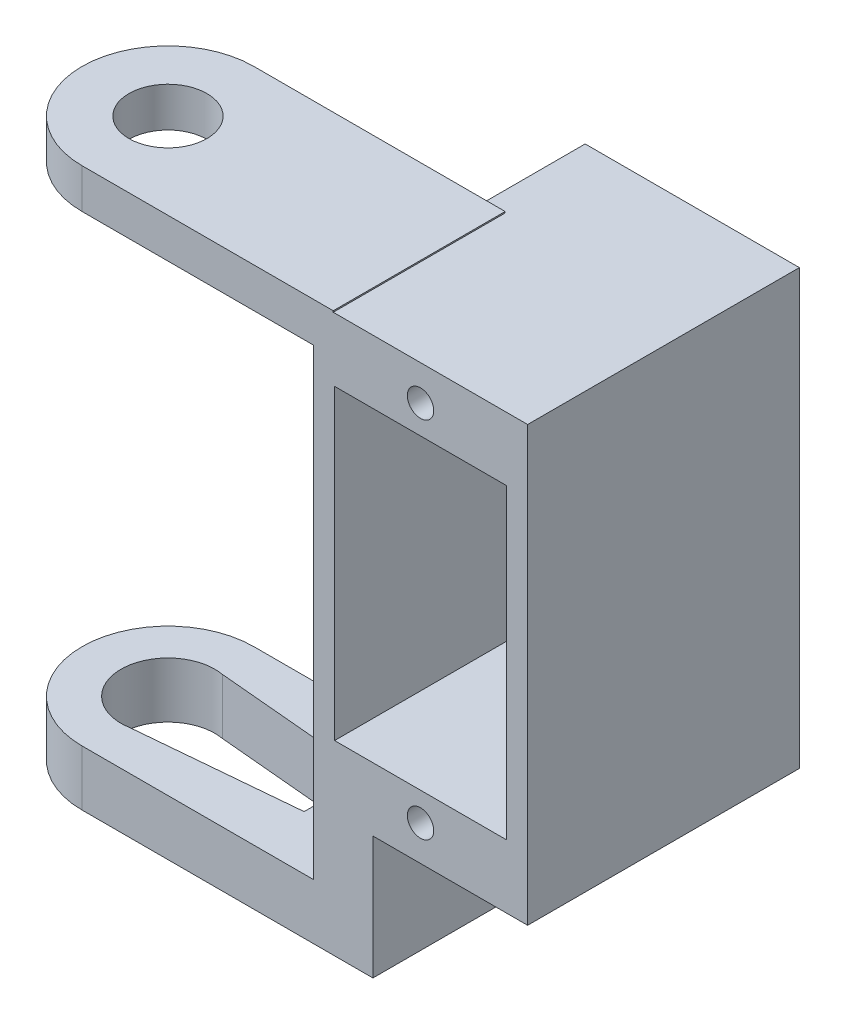
ISO-10303-21;
HEADER;
FILE_DESCRIPTION(('STEP AP214'),'2;1');
FILE_NAME('part.step','',(''),(''),'','','');
FILE_SCHEMA(('AUTOMOTIVE_DESIGN { 1 0 10303 214 1 1 1 1 }'));
ENDSEC;
DATA;
#1=APPLICATION_CONTEXT('core data for automotive mechanical design processes');
#2=APPLICATION_PROTOCOL_DEFINITION('international standard','automotive_design',2000,#1);
#3=PRODUCT_CONTEXT('',#1,'mechanical');
#4=PRODUCT('Part','Part','',(#3));
#5=PRODUCT_RELATED_PRODUCT_CATEGORY('part','',(#4));
#6=PRODUCT_DEFINITION_FORMATION('','',#4);
#7=PRODUCT_DEFINITION_CONTEXT('part definition',#1,'design');
#8=PRODUCT_DEFINITION('design','',#6,#7);
#9=PRODUCT_DEFINITION_SHAPE('','',#8);
#10=(LENGTH_UNIT() NAMED_UNIT(*) SI_UNIT(.MILLI.,.METRE.));
#11=(NAMED_UNIT(*) PLANE_ANGLE_UNIT() SI_UNIT($,.RADIAN.));
#12=(NAMED_UNIT(*) SI_UNIT($,.STERADIAN.) SOLID_ANGLE_UNIT());
#13=UNCERTAINTY_MEASURE_WITH_UNIT(LENGTH_MEASURE(1.E-05),#10,'distance_accuracy_value','');
#14=(GEOMETRIC_REPRESENTATION_CONTEXT(3) GLOBAL_UNCERTAINTY_ASSIGNED_CONTEXT((#13)) GLOBAL_UNIT_ASSIGNED_CONTEXT((#10,
#11,#12)) REPRESENTATION_CONTEXT('',''));
#15=CARTESIAN_POINT('',(0.,0.,0.));
#16=DIRECTION('',(0.,0.,1.));
#17=DIRECTION('',(1.,0.,0.));
#18=AXIS2_PLACEMENT_3D('',#15,#16,#17);
#19=CARTESIAN_POINT('',(-67.5,-75.4,6.5));
#20=DIRECTION('',(1.,0.,0.));
#21=DIRECTION('',(0.,0.,-1.));
#22=AXIS2_PLACEMENT_3D('',#19,#20,#21);
#23=PLANE('',#22);
#24=DIRECTION('',(0.,-1.,0.));
#25=VECTOR('',#24,1.);
#26=CARTESIAN_POINT('',(-67.5,-75.4,-6.50000000000001));
#27=LINE('',#26,#25);
#28=CARTESIAN_POINT('',(-67.5,-42.6,-6.50000000000001));
#29=VERTEX_POINT('',#28);
#30=CARTESIAN_POINT('',(-67.5,-45.5,-6.50000000000001));
#31=VERTEX_POINT('',#30);
#32=EDGE_CURVE('E380',#29,#31,#27,.T.);
#33=ORIENTED_EDGE('',*,*,#32,.F.);
#34=DIRECTION('',(0.,0.,-1.));
#35=VECTOR('',#34,1.);
#36=CARTESIAN_POINT('',(-67.5,-42.6,6.5));
#37=LINE('',#36,#35);
#38=CARTESIAN_POINT('',(-67.5,-42.6,-14.05));
#39=VERTEX_POINT('',#38);
#40=EDGE_CURVE('E486',#29,#39,#37,.T.);
#41=ORIENTED_EDGE('',*,*,#40,.T.);
#42=DIRECTION('',(0.,-1.,0.));
#43=VECTOR('',#42,1.);
#44=CARTESIAN_POINT('',(-67.5,-75.4,-14.05));
#45=LINE('',#44,#43);
#46=CARTESIAN_POINT('',(-67.5,-75.4,-14.05));
#47=VERTEX_POINT('',#46);
#48=EDGE_CURVE('E471',#39,#47,#45,.T.);
#49=ORIENTED_EDGE('',*,*,#48,.T.);
#50=DIRECTION('',(0.,0.,-1.));
#51=VECTOR('',#50,1.);
#52=CARTESIAN_POINT('',(-67.5,-75.4,6.5));
#53=LINE('',#52,#51);
#54=CARTESIAN_POINT('',(-67.5,-75.4,-6.5));
#55=VERTEX_POINT('',#54);
#56=EDGE_CURVE('E509',#55,#47,#53,.T.);
#57=ORIENTED_EDGE('',*,*,#56,.F.);
#58=DIRECTION('',(0.,1.,0.));
#59=VECTOR('',#58,1.);
#60=CARTESIAN_POINT('',(-67.5,-84.7,-6.5));
#61=LINE('',#60,#59);
#62=CARTESIAN_POINT('',(-67.5,-80.5,-6.50000000000001));
#63=VERTEX_POINT('',#62);
#64=EDGE_CURVE('E447',#63,#55,#61,.T.);
#65=ORIENTED_EDGE('',*,*,#64,.F.);
#66=DIRECTION('',(0.,0.,-1.));
#67=VECTOR('',#66,1.);
#68=CARTESIAN_POINT('',(-67.5,-80.5,6.5));
#69=LINE('',#68,#67);
#70=CARTESIAN_POINT('',(-67.5,-80.5,6.50000000000001));
#71=VERTEX_POINT('',#70);
#72=EDGE_CURVE('E444',#71,#63,#69,.T.);
#73=ORIENTED_EDGE('',*,*,#72,.F.);
#74=DIRECTION('',(0.,-1.,0.));
#75=VECTOR('',#74,1.);
#76=CARTESIAN_POINT('',(-67.5,-75.4,6.5));
#77=LINE('',#76,#75);
#78=CARTESIAN_POINT('',(-67.5,-45.5,6.5));
#79=VERTEX_POINT('',#78);
#80=EDGE_CURVE('E472',#79,#71,#77,.T.);
#81=ORIENTED_EDGE('',*,*,#80,.F.);
#82=DIRECTION('',(0.,0.,-1.));
#83=VECTOR('',#82,1.);
#84=CARTESIAN_POINT('',(-67.5,-45.5,6.5));
#85=LINE('',#84,#83);
#86=EDGE_CURVE('E373',#79,#31,#85,.T.);
#87=ORIENTED_EDGE('',*,*,#86,.T.);
#88=EDGE_LOOP('',(#33,#41,#49,#57,#65,#73,#81,#87));
#89=FACE_BOUND('',#88,.T.);
#90=ADVANCED_FACE('F39',(#89),#23,.F.);
#91=CARTESIAN_POINT('',(-67.5,-42.6,6.5));
#92=DIRECTION('',(0.,-1.,0.));
#93=DIRECTION('',(0.,0.,-1.));
#94=AXIS2_PLACEMENT_3D('',#91,#92,#93);
#95=PLANE('',#94);
#96=DIRECTION('',(0.,0.,-1.));
#97=VECTOR('',#96,1.);
#98=CARTESIAN_POINT('',(-66.,-42.6,6.5));
#99=LINE('',#98,#97);
#100=CARTESIAN_POINT('',(-66.,-42.6,6.5));
#101=VERTEX_POINT('',#100);
#102=CARTESIAN_POINT('',(-66.,-42.6,-6.50000000000001));
#103=VERTEX_POINT('',#102);
#104=EDGE_CURVE('E376',#101,#103,#99,.T.);
#105=ORIENTED_EDGE('',*,*,#104,.F.);
#106=DIRECTION('',(-1.,0.,0.));
#107=VECTOR('',#106,1.);
#108=CARTESIAN_POINT('',(-67.5,-42.6,6.5));
#109=LINE('',#108,#107);
#110=CARTESIAN_POINT('',(-51.3,-42.6,6.5));
#111=VERTEX_POINT('',#110);
#112=EDGE_CURVE('E482',#111,#101,#109,.T.);
#113=ORIENTED_EDGE('',*,*,#112,.F.);
#114=DIRECTION('',(0.,0.,-1.));
#115=VECTOR('',#114,1.);
#116=CARTESIAN_POINT('',(-51.3,-42.6,6.5));
#117=LINE('',#116,#115);
#118=CARTESIAN_POINT('',(-51.3,-42.6,-14.05));
#119=VERTEX_POINT('',#118);
#120=EDGE_CURVE('E501',#111,#119,#117,.T.);
#121=ORIENTED_EDGE('',*,*,#120,.T.);
#122=DIRECTION('',(-1.,0.,0.));
#123=VECTOR('',#122,1.);
#124=CARTESIAN_POINT('',(-67.5,-42.6,-14.05));
#125=LINE('',#124,#123);
#126=EDGE_CURVE('E476',#119,#39,#125,.T.);
#127=ORIENTED_EDGE('',*,*,#126,.T.);
#128=ORIENTED_EDGE('',*,*,#40,.F.);
#129=DIRECTION('',(-1.,0.,0.));
#130=VECTOR('',#129,1.);
#131=CARTESIAN_POINT('',(-67.5,-42.6,-6.50000000000001));
#132=LINE('',#131,#130);
#133=EDGE_CURVE('E11',#103,#29,#132,.T.);
#134=ORIENTED_EDGE('',*,*,#133,.F.);
#135=EDGE_LOOP('',(#105,#113,#121,#127,#128,#134));
#136=FACE_BOUND('',#135,.T.);
#137=ADVANCED_FACE('F552',(#136),#95,.F.);
#138=CARTESIAN_POINT('',(-67.5,-75.4,6.5));
#139=DIRECTION('',(0.,1.,0.));
#140=DIRECTION('',(0.,0.,1.));
#141=AXIS2_PLACEMENT_3D('',#138,#139,#140);
#142=PLANE('',#141);
#143=DIRECTION('',(-1.,0.,0.));
#144=VECTOR('',#143,1.);
#145=CARTESIAN_POINT('',(-61.6,-75.4,-10.75));
#146=LINE('',#145,#144);
#147=CARTESIAN_POINT('',(-57.2,-75.4,-10.75));
#148=VERTEX_POINT('',#147);
#149=CARTESIAN_POINT('',(-61.6,-75.4,-10.75));
#150=VERTEX_POINT('',#149);
#151=EDGE_CURVE('E224',#148,#150,#146,.T.);
#152=ORIENTED_EDGE('',*,*,#151,.T.);
#153=DIRECTION('',(0.,0.,1.));
#154=VECTOR('',#153,1.);
#155=CARTESIAN_POINT('',(-61.6,-75.4,-4.75));
#156=LINE('',#155,#154);
#157=CARTESIAN_POINT('',(-61.6,-75.4,-4.75));
#158=VERTEX_POINT('',#157);
#159=EDGE_CURVE('E215',#150,#158,#156,.T.);
#160=ORIENTED_EDGE('',*,*,#159,.T.);
#161=DIRECTION('',(1.,0.,0.));
#162=VECTOR('',#161,1.);
#163=CARTESIAN_POINT('',(-61.6,-75.4,-4.75));
#164=LINE('',#163,#162);
#165=CARTESIAN_POINT('',(-57.2,-75.4,-4.75));
#166=VERTEX_POINT('',#165);
#167=EDGE_CURVE('E227',#158,#166,#164,.T.);
#168=ORIENTED_EDGE('',*,*,#167,.T.);
#169=DIRECTION('',(0.,0.,-1.));
#170=VECTOR('',#169,1.);
#171=CARTESIAN_POINT('',(-57.2,-75.4,-4.75));
#172=LINE('',#171,#170);
#173=EDGE_CURVE('E54',#166,#148,#172,.T.);
#174=ORIENTED_EDGE('',*,*,#173,.T.);
#175=EDGE_LOOP('',(#152,#160,#168,#174));
#176=FACE_BOUND('',#175,.T.);
#177=DIRECTION('',(1.,0.,0.));
#178=VECTOR('',#177,1.);
#179=CARTESIAN_POINT('',(-67.5,-75.4,-6.5));
#180=LINE('',#179,#178);
#181=CARTESIAN_POINT('',(-63.,-75.4,-6.5));
#182=VERTEX_POINT('',#181);
#183=EDGE_CURVE('E512',#55,#182,#180,.T.);
#184=ORIENTED_EDGE('',*,*,#183,.F.);
#185=ORIENTED_EDGE('',*,*,#56,.T.);
#186=DIRECTION('',(1.,0.,0.));
#187=VECTOR('',#186,1.);
#188=CARTESIAN_POINT('',(-67.5,-75.4,-14.05));
#189=LINE('',#188,#187);
#190=CARTESIAN_POINT('',(-51.3,-75.4,-14.05));
#191=VERTEX_POINT('',#190);
#192=EDGE_CURVE('E490',#47,#191,#189,.T.);
#193=ORIENTED_EDGE('',*,*,#192,.T.);
#194=DIRECTION('',(0.,0.,-1.));
#195=VECTOR('',#194,1.);
#196=CARTESIAN_POINT('',(-51.3,-75.4,6.5));
#197=LINE('',#196,#195);
#198=CARTESIAN_POINT('',(-51.3,-75.4,6.5));
#199=VERTEX_POINT('',#198);
#200=EDGE_CURVE('E505',#199,#191,#197,.T.);
#201=ORIENTED_EDGE('',*,*,#200,.F.);
#202=DIRECTION('',(1.,0.,0.));
#203=VECTOR('',#202,1.);
#204=CARTESIAN_POINT('',(-67.5,-75.4,6.5));
#205=LINE('',#204,#203);
#206=CARTESIAN_POINT('',(-63.,-75.4,6.5));
#207=VERTEX_POINT('',#206);
#208=EDGE_CURVE('E475',#207,#199,#205,.T.);
#209=ORIENTED_EDGE('',*,*,#208,.F.);
#210=DIRECTION('',(0.,0.,1.));
#211=VECTOR('',#210,1.);
#212=CARTESIAN_POINT('',(-63.,-75.4,6.5));
#213=LINE('',#212,#211);
#214=EDGE_CURVE('E467',#182,#207,#213,.T.);
#215=ORIENTED_EDGE('',*,*,#214,.F.);
#216=EDGE_LOOP('',(#184,#185,#193,#201,#209,#215));
#217=FACE_BOUND('',#216,.T.);
#218=ADVANCED_FACE('F232',(#176,#217),#142,.F.);
#219=CARTESIAN_POINT('',(-51.3,-75.4,6.5));
#220=DIRECTION('',(-1.,0.,0.));
#221=DIRECTION('',(0.,0.,1.));
#222=AXIS2_PLACEMENT_3D('',#219,#220,#221);
#223=PLANE('',#222);
#224=DIRECTION('',(0.,1.,0.));
#225=VECTOR('',#224,1.);
#226=CARTESIAN_POINT('',(-51.3,-75.4,-14.05));
#227=LINE('',#226,#225);
#228=EDGE_CURVE('E493',#191,#119,#227,.T.);
#229=ORIENTED_EDGE('',*,*,#228,.T.);
#230=ORIENTED_EDGE('',*,*,#120,.F.);
#231=DIRECTION('',(0.,1.,0.));
#232=VECTOR('',#231,1.);
#233=CARTESIAN_POINT('',(-51.3,-75.4,6.5));
#234=LINE('',#233,#232);
#235=EDGE_CURVE('E479',#199,#111,#234,.T.);
#236=ORIENTED_EDGE('',*,*,#235,.F.);
#237=ORIENTED_EDGE('',*,*,#200,.T.);
#238=EDGE_LOOP('',(#229,#230,#236,#237));
#239=FACE_BOUND('',#238,.T.);
#240=ADVANCED_FACE('F722',(#239),#223,.F.);
#241=CARTESIAN_POINT('',(0.,0.,6.5));
#242=DIRECTION('',(0.,0.,-1.));
#243=DIRECTION('',(-1.,0.,0.));
#244=AXIS2_PLACEMENT_3D('',#241,#242,#243);
#245=PLANE('',#244);
#246=CARTESIAN_POINT('',(-59.4,-72.75,6.5));
#247=DIRECTION('',(0.,0.,1.));
#248=DIRECTION('',(1.,0.,0.));
#249=AXIS2_PLACEMENT_3D('',#246,#247,#248);
#250=CIRCLE('',#249,1.);
#251=CARTESIAN_POINT('',(-58.4,-72.75,6.5));
#252=VERTEX_POINT('',#251);
#253=EDGE_CURVE('E262',#252,#252,#250,.T.);
#254=ORIENTED_EDGE('',*,*,#253,.F.);
#255=EDGE_LOOP('',(#254));
#256=FACE_BOUND('',#255,.T.);
#257=CARTESIAN_POINT('',(-59.4,-45.25,6.5));
#258=DIRECTION('',(0.,0.,1.));
#259=DIRECTION('',(1.,0.,0.));
#260=AXIS2_PLACEMENT_3D('',#257,#258,#259);
#261=CIRCLE('',#260,1.);
#262=CARTESIAN_POINT('',(-58.4,-45.25,6.5));
#263=VERTEX_POINT('',#262);
#264=EDGE_CURVE('E270',#263,#263,#261,.T.);
#265=ORIENTED_EDGE('',*,*,#264,.F.);
#266=EDGE_LOOP('',(#265));
#267=FACE_BOUND('',#266,.T.);
#268=DIRECTION('',(1.,0.,0.));
#269=VECTOR('',#268,1.);
#270=CARTESIAN_POINT('',(-65.9,-70.6,6.5));
#271=LINE('',#270,#269);
#272=CARTESIAN_POINT('',(-65.9,-70.6,6.5));
#273=VERTEX_POINT('',#272);
#274=CARTESIAN_POINT('',(-52.9,-70.6,6.5));
#275=VERTEX_POINT('',#274);
#276=EDGE_CURVE('E303',#273,#275,#271,.T.);
#277=ORIENTED_EDGE('',*,*,#276,.F.);
#278=DIRECTION('',(0.,-1.,0.));
#279=VECTOR('',#278,1.);
#280=CARTESIAN_POINT('',(-65.9,-70.6,6.5));
#281=LINE('',#280,#279);
#282=CARTESIAN_POINT('',(-65.9,-47.4,6.5));
#283=VERTEX_POINT('',#282);
#284=EDGE_CURVE('E278',#283,#273,#281,.T.);
#285=ORIENTED_EDGE('',*,*,#284,.F.);
#286=DIRECTION('',(-1.,0.,0.));
#287=VECTOR('',#286,1.);
#288=CARTESIAN_POINT('',(-65.9,-47.4,6.5));
#289=LINE('',#288,#287);
#290=CARTESIAN_POINT('',(-52.9,-47.4,6.5));
#291=VERTEX_POINT('',#290);
#292=EDGE_CURVE('E287',#291,#283,#289,.T.);
#293=ORIENTED_EDGE('',*,*,#292,.F.);
#294=DIRECTION('',(0.,1.,0.));
#295=VECTOR('',#294,1.);
#296=CARTESIAN_POINT('',(-52.9,-70.6,6.5));
#297=LINE('',#296,#295);
#298=EDGE_CURVE('E307',#275,#291,#297,.T.);
#299=ORIENTED_EDGE('',*,*,#298,.F.);
#300=EDGE_LOOP('',(#277,#285,#293,#299));
#301=FACE_BOUND('',#300,.T.);
#302=DIRECTION('',(1.,0.,0.));
#303=VECTOR('',#302,1.);
#304=CARTESIAN_POINT('',(-85.,-45.5,6.50000000000001));
#305=LINE('',#304,#303);
#306=CARTESIAN_POINT('',(-85.,-45.5,6.50000000000001));
#307=VERTEX_POINT('',#306);
#308=EDGE_CURVE('E339',#307,#79,#305,.T.);
#309=ORIENTED_EDGE('',*,*,#308,.T.);
#310=ORIENTED_EDGE('',*,*,#80,.T.);
#311=DIRECTION('',(1.,0.,0.));
#312=VECTOR('',#311,1.);
#313=CARTESIAN_POINT('',(-85.,-80.5,6.50000000000001));
#314=LINE('',#313,#312);
#315=CARTESIAN_POINT('',(-85.,-80.5,6.50000000000001));
#316=VERTEX_POINT('',#315);
#317=EDGE_CURVE('E427',#316,#71,#314,.T.);
#318=ORIENTED_EDGE('',*,*,#317,.F.);
#319=DIRECTION('',(0.,-1.,0.));
#320=VECTOR('',#319,1.);
#321=CARTESIAN_POINT('',(-85.,-80.5,6.50000000000001));
#322=LINE('',#321,#320);
#323=CARTESIAN_POINT('',(-85.,-84.7,6.50000000000001));
#324=VERTEX_POINT('',#323);
#325=EDGE_CURVE('E441',#316,#324,#322,.T.);
#326=ORIENTED_EDGE('',*,*,#325,.T.);
#327=DIRECTION('',(-1.,0.,0.));
#328=VECTOR('',#327,1.);
#329=CARTESIAN_POINT('',(-63.,-84.7,6.5));
#330=LINE('',#329,#328);
#331=CARTESIAN_POINT('',(-63.,-84.7,6.5));
#332=VERTEX_POINT('',#331);
#333=EDGE_CURVE('E463',#332,#324,#330,.T.);
#334=ORIENTED_EDGE('',*,*,#333,.F.);
#335=DIRECTION('',(0.,-1.,0.));
#336=VECTOR('',#335,1.);
#337=CARTESIAN_POINT('',(-63.,-84.7,6.5));
#338=LINE('',#337,#336);
#339=EDGE_CURVE('E448',#207,#332,#338,.T.);
#340=ORIENTED_EDGE('',*,*,#339,.F.);
#341=ORIENTED_EDGE('',*,*,#208,.T.);
#342=ORIENTED_EDGE('',*,*,#235,.T.);
#343=ORIENTED_EDGE('',*,*,#112,.T.);
#344=DIRECTION('',(0.,-1.,0.));
#345=VECTOR('',#344,1.);
#346=CARTESIAN_POINT('',(-66.,-42.5,6.50000000000001));
#347=LINE('',#346,#345);
#348=CARTESIAN_POINT('',(-66.,-42.5,6.50000000000001));
#349=VERTEX_POINT('',#348);
#350=EDGE_CURVE('E366',#349,#101,#347,.T.);
#351=ORIENTED_EDGE('',*,*,#350,.F.);
#352=DIRECTION('',(1.,0.,0.));
#353=VECTOR('',#352,1.);
#354=CARTESIAN_POINT('',(-85.,-42.5,6.50000000000001));
#355=LINE('',#354,#353);
#356=CARTESIAN_POINT('',(-85.,-42.5,6.50000000000001));
#357=VERTEX_POINT('',#356);
#358=EDGE_CURVE('E343',#357,#349,#355,.T.);
#359=ORIENTED_EDGE('',*,*,#358,.F.);
#360=DIRECTION('',(0.,-1.,0.));
#361=VECTOR('',#360,1.);
#362=CARTESIAN_POINT('',(-85.,-42.5,6.50000000000001));
#363=LINE('',#362,#361);
#364=EDGE_CURVE('E370',#357,#307,#363,.T.);
#365=ORIENTED_EDGE('',*,*,#364,.T.);
#366=EDGE_LOOP('',(#309,#310,#318,#326,#334,#340,#341,#342,#343,#351,#359,#365));
#367=FACE_BOUND('',#366,.T.);
#368=ADVANCED_FACE('F571',(#256,#267,#301,#367),#245,.F.);
#369=CARTESIAN_POINT('',(0.,0.,-14.05));
#370=DIRECTION('',(0.,0.,-1.));
#371=DIRECTION('',(-1.,0.,0.));
#372=AXIS2_PLACEMENT_3D('',#369,#370,#371);
#373=PLANE('',#372);
#374=CARTESIAN_POINT('',(-59.4,-64.5,-14.05));
#375=DIRECTION('',(0.,0.,1.));
#376=DIRECTION('',(1.,0.,0.));
#377=AXIS2_PLACEMENT_3D('',#374,#375,#376);
#378=CIRCLE('',#377,3.15);
#379=CARTESIAN_POINT('',(-56.25,-64.5,-14.05));
#380=VERTEX_POINT('',#379);
#381=EDGE_CURVE('E258',#380,#380,#378,.T.);
#382=ORIENTED_EDGE('',*,*,#381,.T.);
#383=EDGE_LOOP('',(#382));
#384=FACE_BOUND('',#383,.T.);
#385=ORIENTED_EDGE('',*,*,#48,.F.);
#386=ORIENTED_EDGE('',*,*,#126,.F.);
#387=ORIENTED_EDGE('',*,*,#228,.F.);
#388=ORIENTED_EDGE('',*,*,#192,.F.);
#389=EDGE_LOOP('',(#385,#386,#387,#388));
#390=FACE_BOUND('',#389,.T.);
#391=ADVANCED_FACE('F580',(#384,#390),#373,.T.);
#392=CARTESIAN_POINT('',(-63.,-84.7,-6.5));
#393=DIRECTION('',(0.,0.,1.));
#394=DIRECTION('',(1.,0.,0.));
#395=AXIS2_PLACEMENT_3D('',#392,#393,#394);
#396=PLANE('',#395);
#397=DIRECTION('',(-1.,0.,0.));
#398=VECTOR('',#397,1.);
#399=CARTESIAN_POINT('',(-63.,-84.7,-6.5));
#400=LINE('',#399,#398);
#401=CARTESIAN_POINT('',(-63.,-84.7,-6.5));
#402=VERTEX_POINT('',#401);
#403=CARTESIAN_POINT('',(-85.,-84.7,-6.50000000000001));
#404=VERTEX_POINT('',#403);
#405=EDGE_CURVE('E458',#402,#404,#400,.T.);
#406=ORIENTED_EDGE('',*,*,#405,.T.);
#407=DIRECTION('',(0.,-1.,0.));
#408=VECTOR('',#407,1.);
#409=CARTESIAN_POINT('',(-85.,-80.5,-6.50000000000001));
#410=LINE('',#409,#408);
#411=CARTESIAN_POINT('',(-85.,-80.5,-6.50000000000001));
#412=VERTEX_POINT('',#411);
#413=EDGE_CURVE('E437',#412,#404,#410,.T.);
#414=ORIENTED_EDGE('',*,*,#413,.F.);
#415=DIRECTION('',(-1.,0.,0.));
#416=VECTOR('',#415,1.);
#417=CARTESIAN_POINT('',(-85.,-80.5,-6.50000000000001));
#418=LINE('',#417,#416);
#419=EDGE_CURVE('E434',#63,#412,#418,.T.);
#420=ORIENTED_EDGE('',*,*,#419,.F.);
#421=ORIENTED_EDGE('',*,*,#64,.T.);
#422=ORIENTED_EDGE('',*,*,#183,.T.);
#423=DIRECTION('',(0.,1.,0.));
#424=VECTOR('',#423,1.);
#425=CARTESIAN_POINT('',(-63.,-84.7,-6.5));
#426=LINE('',#425,#424);
#427=EDGE_CURVE('E454',#402,#182,#426,.T.);
#428=ORIENTED_EDGE('',*,*,#427,.F.);
#429=EDGE_LOOP('',(#406,#414,#420,#421,#422,#428));
#430=FACE_BOUND('',#429,.T.);
#431=ADVANCED_FACE('F588',(#430),#396,.F.);
#432=CARTESIAN_POINT('',(-63.,0.,0.));
#433=DIRECTION('',(-1.,0.,0.));
#434=DIRECTION('',(0.,0.,1.));
#435=AXIS2_PLACEMENT_3D('',#432,#433,#434);
#436=PLANE('',#435);
#437=ORIENTED_EDGE('',*,*,#427,.T.);
#438=ORIENTED_EDGE('',*,*,#214,.T.);
#439=ORIENTED_EDGE('',*,*,#339,.T.);
#440=DIRECTION('',(0.,0.,-1.));
#441=VECTOR('',#440,1.);
#442=CARTESIAN_POINT('',(-63.,-84.7,6.5));
#443=LINE('',#442,#441);
#444=EDGE_CURVE('E451',#332,#402,#443,.T.);
#445=ORIENTED_EDGE('',*,*,#444,.T.);
#446=EDGE_LOOP('',(#437,#438,#439,#445));
#447=FACE_BOUND('',#446,.T.);
#448=ADVANCED_FACE('F591',(#447),#436,.F.);
#449=CARTESIAN_POINT('',(-63.,-84.7,6.5));
#450=DIRECTION('',(0.,1.,0.));
#451=DIRECTION('',(0.,0.,1.));
#452=AXIS2_PLACEMENT_3D('',#449,#450,#451);
#453=PLANE('',#452);
#454=DIRECTION('',(0.,0.,-1.));
#455=VECTOR('',#454,1.);
#456=CARTESIAN_POINT('',(-72.3,-84.7,2.40328140539589));
#457=LINE('',#456,#455);
#458=CARTESIAN_POINT('',(-72.3,-84.7,2.40328140539589));
#459=VERTEX_POINT('',#458);
#460=CARTESIAN_POINT('',(-72.3,-84.7,-2.40328140539589));
#461=VERTEX_POINT('',#460);
#462=EDGE_CURVE('E389',#459,#461,#457,.T.);
#463=ORIENTED_EDGE('',*,*,#462,.T.);
#464=DIRECTION('',(-0.995948362239352,0.,-0.0899269689956983));
#465=VECTOR('',#464,1.);
#466=CARTESIAN_POINT('',(-72.3,-84.7,-2.40328140539589));
#467=LINE('',#466,#465);
#468=CARTESIAN_POINT('',(-84.3641054158039,-84.7,-3.49258329575545));
#469=VERTEX_POINT('',#468);
#470=EDGE_CURVE('E394',#461,#469,#467,.T.);
#471=ORIENTED_EDGE('',*,*,#470,.T.);
#472=CARTESIAN_POINT('',(-85.,-84.7,0.));
#473=DIRECTION('',(0.,1.,0.));
#474=DIRECTION('',(0.,0.,1.));
#475=AXIS2_PLACEMENT_3D('',#472,#473,#474);
#476=CIRCLE('',#475,3.55);
#477=CARTESIAN_POINT('',(-84.3641054158039,-84.7,3.49258329575545));
#478=VERTEX_POINT('',#477);
#479=EDGE_CURVE('E415',#469,#478,#476,.T.);
#480=ORIENTED_EDGE('',*,*,#479,.T.);
#481=DIRECTION('',(0.995948362239352,0.,-0.0899269689956983));
#482=VECTOR('',#481,1.);
#483=CARTESIAN_POINT('',(-85.,-84.7,3.55));
#484=LINE('',#483,#482);
#485=EDGE_CURVE('E385',#478,#459,#484,.T.);
#486=ORIENTED_EDGE('',*,*,#485,.T.);
#487=EDGE_LOOP('',(#463,#471,#480,#486));
#488=FACE_BOUND('',#487,.T.);
#489=ORIENTED_EDGE('',*,*,#333,.T.);
#490=CARTESIAN_POINT('',(-85.,-84.7,0.));
#491=DIRECTION('',(0.,1.,0.));
#492=DIRECTION('',(0.,0.,1.));
#493=AXIS2_PLACEMENT_3D('',#490,#491,#492);
#494=CIRCLE('',#493,6.50000000000001);
#495=EDGE_CURVE('E419',#404,#324,#494,.T.);
#496=ORIENTED_EDGE('',*,*,#495,.F.);
#497=ORIENTED_EDGE('',*,*,#405,.F.);
#498=ORIENTED_EDGE('',*,*,#444,.F.);
#499=EDGE_LOOP('',(#489,#496,#497,#498));
#500=FACE_BOUND('',#499,.T.);
#501=ADVANCED_FACE('F529',(#488,#500),#453,.F.);
#502=CARTESIAN_POINT('',(0.,-80.5,0.));
#503=DIRECTION('',(0.,-1.,0.));
#504=DIRECTION('',(0.,0.,-1.));
#505=AXIS2_PLACEMENT_3D('',#502,#503,#504);
#506=PLANE('',#505);
#507=CARTESIAN_POINT('',(-85.,-80.5,0.));
#508=DIRECTION('',(0.,1.,0.));
#509=DIRECTION('',(0.,0.,1.));
#510=AXIS2_PLACEMENT_3D('',#507,#508,#509);
#511=CIRCLE('',#510,3.55);
#512=CARTESIAN_POINT('',(-84.3641054158039,-80.5,-3.49258329575545));
#513=VERTEX_POINT('',#512);
#514=CARTESIAN_POINT('',(-84.3641054158039,-80.5,3.49258329575545));
#515=VERTEX_POINT('',#514);
#516=EDGE_CURVE('E411',#513,#515,#511,.T.);
#517=ORIENTED_EDGE('',*,*,#516,.F.);
#518=DIRECTION('',(-0.995948362239352,0.,-0.0899269689956983));
#519=VECTOR('',#518,1.);
#520=CARTESIAN_POINT('',(-72.3,-80.5,-2.40328140539589));
#521=LINE('',#520,#519);
#522=CARTESIAN_POINT('',(-72.3,-80.5,-2.40328140539589));
#523=VERTEX_POINT('',#522);
#524=EDGE_CURVE('E390',#523,#513,#521,.T.);
#525=ORIENTED_EDGE('',*,*,#524,.F.);
#526=DIRECTION('',(0.,0.,-1.));
#527=VECTOR('',#526,1.);
#528=CARTESIAN_POINT('',(-72.3,-80.5,2.40328140539589));
#529=LINE('',#528,#527);
#530=CARTESIAN_POINT('',(-72.3,-80.5,2.40328140539589));
#531=VERTEX_POINT('',#530);
#532=EDGE_CURVE('E401',#531,#523,#529,.T.);
#533=ORIENTED_EDGE('',*,*,#532,.F.);
#534=DIRECTION('',(0.995948362239352,0.,-0.0899269689956983));
#535=VECTOR('',#534,1.);
#536=CARTESIAN_POINT('',(-85.,-80.5,3.55));
#537=LINE('',#536,#535);
#538=EDGE_CURVE('E384',#515,#531,#537,.T.);
#539=ORIENTED_EDGE('',*,*,#538,.F.);
#540=EDGE_LOOP('',(#517,#525,#533,#539));
#541=FACE_BOUND('',#540,.T.);
#542=ORIENTED_EDGE('',*,*,#419,.T.);
#543=CARTESIAN_POINT('',(-85.,-80.5,0.));
#544=DIRECTION('',(0.,1.,0.));
#545=DIRECTION('',(0.,0.,1.));
#546=AXIS2_PLACEMENT_3D('',#543,#544,#545);
#547=CIRCLE('',#546,6.50000000000001);
#548=EDGE_CURVE('E423',#412,#316,#547,.T.);
#549=ORIENTED_EDGE('',*,*,#548,.T.);
#550=ORIENTED_EDGE('',*,*,#317,.T.);
#551=ORIENTED_EDGE('',*,*,#72,.T.);
#552=EDGE_LOOP('',(#542,#549,#550,#551));
#553=FACE_BOUND('',#552,.T.);
#554=ADVANCED_FACE('F537',(#541,#553),#506,.F.);
#555=CARTESIAN_POINT('',(-85.,-80.5,0.));
#556=DIRECTION('',(0.,-1.,0.));
#557=DIRECTION('',(0.,0.,-1.));
#558=AXIS2_PLACEMENT_3D('',#555,#556,#557);
#559=CYLINDRICAL_SURFACE('',#558,6.50000000000001);
#560=ORIENTED_EDGE('',*,*,#495,.T.);
#561=ORIENTED_EDGE('',*,*,#325,.F.);
#562=ORIENTED_EDGE('',*,*,#548,.F.);
#563=ORIENTED_EDGE('',*,*,#413,.T.);
#564=EDGE_LOOP('',(#560,#561,#562,#563));
#565=FACE_BOUND('',#564,.T.);
#566=ADVANCED_FACE('F600',(#565),#559,.T.);
#567=CARTESIAN_POINT('',(-85.,-84.7,0.));
#568=DIRECTION('',(0.,1.,0.));
#569=DIRECTION('',(0.,0.,1.));
#570=AXIS2_PLACEMENT_3D('',#567,#568,#569);
#571=CYLINDRICAL_SURFACE('',#570,3.55);
#572=ORIENTED_EDGE('',*,*,#516,.T.);
#573=DIRECTION('',(0.,1.,0.));
#574=VECTOR('',#573,1.);
#575=CARTESIAN_POINT('',(-84.3641054158039,-84.7,3.49258329575545));
#576=LINE('',#575,#574);
#577=EDGE_CURVE('E516',#515,#478,#576,.F.);
#578=ORIENTED_EDGE('',*,*,#577,.T.);
#579=ORIENTED_EDGE('',*,*,#479,.F.);
#580=DIRECTION('',(0.,1.,0.));
#581=VECTOR('',#580,1.);
#582=CARTESIAN_POINT('',(-84.3641054158039,-84.7,-3.49258329575545));
#583=LINE('',#582,#581);
#584=EDGE_CURVE('E47',#469,#513,#583,.T.);
#585=ORIENTED_EDGE('',*,*,#584,.T.);
#586=EDGE_LOOP('',(#572,#578,#579,#585));
#587=FACE_BOUND('',#586,.T.);
#588=ADVANCED_FACE('F523',(#587),#571,.F.);
#589=CARTESIAN_POINT('',(-72.3,-84.7,-2.40328140539589));
#590=DIRECTION('',(0.0899269689956983,0.,-0.995948362239352));
#591=DIRECTION('',(-0.995948362239352,0.,-0.0899269689956983));
#592=AXIS2_PLACEMENT_3D('',#589,#590,#591);
#593=PLANE('',#592);
#594=ORIENTED_EDGE('',*,*,#470,.F.);
#595=DIRECTION('',(0.,1.,0.));
#596=VECTOR('',#595,1.);
#597=CARTESIAN_POINT('',(-72.3,-84.7,-2.40328140539589));
#598=LINE('',#597,#596);
#599=EDGE_CURVE('E408',#461,#523,#598,.T.);
#600=ORIENTED_EDGE('',*,*,#599,.T.);
#601=ORIENTED_EDGE('',*,*,#524,.T.);
#602=ORIENTED_EDGE('',*,*,#584,.F.);
#603=EDGE_LOOP('',(#594,#600,#601,#602));
#604=FACE_BOUND('',#603,.T.);
#605=ADVANCED_FACE('F526',(#604),#593,.F.);
#606=CARTESIAN_POINT('',(-85.,-84.7,3.55));
#607=DIRECTION('',(0.0899269689956983,0.,0.995948362239352));
#608=DIRECTION('',(0.995948362239352,0.,-0.0899269689956983));
#609=AXIS2_PLACEMENT_3D('',#606,#607,#608);
#610=PLANE('',#609);
#611=ORIENTED_EDGE('',*,*,#538,.T.);
#612=DIRECTION('',(0.,1.,0.));
#613=VECTOR('',#612,1.);
#614=CARTESIAN_POINT('',(-72.3,-84.7,2.40328140539589));
#615=LINE('',#614,#613);
#616=EDGE_CURVE('E398',#459,#531,#615,.T.);
#617=ORIENTED_EDGE('',*,*,#616,.F.);
#618=ORIENTED_EDGE('',*,*,#485,.F.);
#619=ORIENTED_EDGE('',*,*,#577,.F.);
#620=EDGE_LOOP('',(#611,#617,#618,#619));
#621=FACE_BOUND('',#620,.T.);
#622=ADVANCED_FACE('F540',(#621),#610,.F.);
#623=CARTESIAN_POINT('',(-72.3,-84.7,2.40328140539589));
#624=DIRECTION('',(1.,0.,0.));
#625=DIRECTION('',(0.,0.,-1.));
#626=AXIS2_PLACEMENT_3D('',#623,#624,#625);
#627=PLANE('',#626);
#628=ORIENTED_EDGE('',*,*,#532,.T.);
#629=ORIENTED_EDGE('',*,*,#599,.F.);
#630=ORIENTED_EDGE('',*,*,#462,.F.);
#631=ORIENTED_EDGE('',*,*,#616,.T.);
#632=EDGE_LOOP('',(#628,#629,#630,#631));
#633=FACE_BOUND('',#632,.T.);
#634=ADVANCED_FACE('F533',(#633),#627,.F.);
#635=CARTESIAN_POINT('',(-85.,-42.5,-6.50000000000001));
#636=DIRECTION('',(0.,0.,1.));
#637=DIRECTION('',(1.,0.,0.));
#638=AXIS2_PLACEMENT_3D('',#635,#636,#637);
#639=PLANE('',#638);
#640=ORIENTED_EDGE('',*,*,#133,.T.);
#641=ORIENTED_EDGE('',*,*,#32,.T.);
#642=DIRECTION('',(-1.,0.,0.));
#643=VECTOR('',#642,1.);
#644=CARTESIAN_POINT('',(-85.,-45.5,-6.50000000000001));
#645=LINE('',#644,#643);
#646=CARTESIAN_POINT('',(-85.,-45.5,-6.50000000000001));
#647=VERTEX_POINT('',#646);
#648=EDGE_CURVE('E347',#31,#647,#645,.T.);
#649=ORIENTED_EDGE('',*,*,#648,.T.);
#650=DIRECTION('',(0.,-1.,0.));
#651=VECTOR('',#650,1.);
#652=CARTESIAN_POINT('',(-85.,-42.5,-6.50000000000001));
#653=LINE('',#652,#651);
#654=CARTESIAN_POINT('',(-85.,-42.5,-6.50000000000001));
#655=VERTEX_POINT('',#654);
#656=EDGE_CURVE('E353',#655,#647,#653,.T.);
#657=ORIENTED_EDGE('',*,*,#656,.F.);
#658=DIRECTION('',(-1.,0.,0.));
#659=VECTOR('',#658,1.);
#660=CARTESIAN_POINT('',(-85.,-42.5,-6.50000000000001));
#661=LINE('',#660,#659);
#662=CARTESIAN_POINT('',(-66.,-42.5,-6.50000000000001));
#663=VERTEX_POINT('',#662);
#664=EDGE_CURVE('E350',#663,#655,#661,.T.);
#665=ORIENTED_EDGE('',*,*,#664,.F.);
#666=DIRECTION('',(0.,-1.,0.));
#667=VECTOR('',#666,1.);
#668=CARTESIAN_POINT('',(-66.,-42.5,-6.50000000000001));
#669=LINE('',#668,#667);
#670=EDGE_CURVE('E362',#663,#103,#669,.T.);
#671=ORIENTED_EDGE('',*,*,#670,.T.);
#672=EDGE_LOOP('',(#640,#641,#649,#657,#665,#671));
#673=FACE_BOUND('',#672,.T.);
#674=ADVANCED_FACE('F547',(#673),#639,.F.);
#675=CARTESIAN_POINT('',(-66.,-42.5,6.50000000000001));
#676=DIRECTION('',(-1.,0.,0.));
#677=DIRECTION('',(0.,0.,1.));
#678=AXIS2_PLACEMENT_3D('',#675,#676,#677);
#679=PLANE('',#678);
#680=ORIENTED_EDGE('',*,*,#350,.T.);
#681=ORIENTED_EDGE('',*,*,#104,.T.);
#682=ORIENTED_EDGE('',*,*,#670,.F.);
#683=DIRECTION('',(0.,0.,-1.));
#684=VECTOR('',#683,1.);
#685=CARTESIAN_POINT('',(-66.,-42.5,6.50000000000001));
#686=LINE('',#685,#684);
#687=EDGE_CURVE('E346',#349,#663,#686,.T.);
#688=ORIENTED_EDGE('',*,*,#687,.F.);
#689=EDGE_LOOP('',(#680,#681,#682,#688));
#690=FACE_BOUND('',#689,.T.);
#691=ADVANCED_FACE('F567',(#690),#679,.F.);
#692=CARTESIAN_POINT('',(0.,-45.5,0.));
#693=DIRECTION('',(0.,-1.,0.));
#694=DIRECTION('',(0.,0.,-1.));
#695=AXIS2_PLACEMENT_3D('',#692,#693,#694);
#696=PLANE('',#695);
#697=CARTESIAN_POINT('',(-85.,-45.5,0.));
#698=DIRECTION('',(0.,1.,0.));
#699=DIRECTION('',(0.,0.,1.));
#700=AXIS2_PLACEMENT_3D('',#697,#698,#699);
#701=CIRCLE('',#700,2.94999999999999);
#702=CARTESIAN_POINT('',(-85.,-45.5,2.94999999999999));
#703=VERTEX_POINT('',#702);
#704=EDGE_CURVE('E327',#703,#703,#701,.T.);
#705=ORIENTED_EDGE('',*,*,#704,.T.);
#706=EDGE_LOOP('',(#705));
#707=FACE_BOUND('',#706,.T.);
#708=ORIENTED_EDGE('',*,*,#308,.F.);
#709=CARTESIAN_POINT('',(-85.,-45.5,0.));
#710=DIRECTION('',(0.,1.,0.));
#711=DIRECTION('',(0.,0.,1.));
#712=AXIS2_PLACEMENT_3D('',#709,#710,#711);
#713=CIRCLE('',#712,6.50000000000001);
#714=EDGE_CURVE('E331',#647,#307,#713,.T.);
#715=ORIENTED_EDGE('',*,*,#714,.F.);
#716=ORIENTED_EDGE('',*,*,#648,.F.);
#717=ORIENTED_EDGE('',*,*,#86,.F.);
#718=EDGE_LOOP('',(#708,#715,#716,#717));
#719=FACE_BOUND('',#718,.T.);
#720=ADVANCED_FACE('F604',(#707,#719),#696,.T.);
#721=CARTESIAN_POINT('',(0.,-42.5,0.));
#722=DIRECTION('',(0.,-1.,0.));
#723=DIRECTION('',(0.,0.,-1.));
#724=AXIS2_PLACEMENT_3D('',#721,#722,#723);
#725=PLANE('',#724);
#726=CARTESIAN_POINT('',(-85.,-42.5,0.));
#727=DIRECTION('',(0.,1.,0.));
#728=DIRECTION('',(0.,0.,1.));
#729=AXIS2_PLACEMENT_3D('',#726,#727,#728);
#730=CIRCLE('',#729,2.94999999999999);
#731=CARTESIAN_POINT('',(-85.,-42.5,2.94999999999999));
#732=VERTEX_POINT('',#731);
#733=EDGE_CURVE('E317',#732,#732,#730,.T.);
#734=ORIENTED_EDGE('',*,*,#733,.F.);
#735=EDGE_LOOP('',(#734));
#736=FACE_BOUND('',#735,.T.);
#737=ORIENTED_EDGE('',*,*,#664,.T.);
#738=CARTESIAN_POINT('',(-85.,-42.5,0.));
#739=DIRECTION('',(0.,1.,0.));
#740=DIRECTION('',(0.,0.,1.));
#741=AXIS2_PLACEMENT_3D('',#738,#739,#740);
#742=CIRCLE('',#741,6.50000000000001);
#743=EDGE_CURVE('E335',#655,#357,#742,.T.);
#744=ORIENTED_EDGE('',*,*,#743,.T.);
#745=ORIENTED_EDGE('',*,*,#358,.T.);
#746=ORIENTED_EDGE('',*,*,#687,.T.);
#747=EDGE_LOOP('',(#737,#744,#745,#746));
#748=FACE_BOUND('',#747,.T.);
#749=ADVANCED_FACE('F610',(#736,#748),#725,.F.);
#750=CARTESIAN_POINT('',(-85.,-42.5,0.));
#751=DIRECTION('',(0.,-1.,0.));
#752=DIRECTION('',(0.,0.,-1.));
#753=AXIS2_PLACEMENT_3D('',#750,#751,#752);
#754=CYLINDRICAL_SURFACE('',#753,6.50000000000001);
#755=ORIENTED_EDGE('',*,*,#714,.T.);
#756=ORIENTED_EDGE('',*,*,#364,.F.);
#757=ORIENTED_EDGE('',*,*,#743,.F.);
#758=ORIENTED_EDGE('',*,*,#656,.T.);
#759=EDGE_LOOP('',(#755,#756,#757,#758));
#760=FACE_BOUND('',#759,.T.);
#761=ADVANCED_FACE('F608',(#760),#754,.T.);
#762=CARTESIAN_POINT('',(-85.,-45.5,0.));
#763=DIRECTION('',(0.,1.,0.));
#764=DIRECTION('',(0.,0.,1.));
#765=AXIS2_PLACEMENT_3D('',#762,#763,#764);
#766=CYLINDRICAL_SURFACE('',#765,2.94999999999999);
#767=ORIENTED_EDGE('',*,*,#704,.F.);
#768=EDGE_LOOP('',(#767));
#769=FACE_BOUND('',#768,.T.);
#770=ORIENTED_EDGE('',*,*,#733,.T.);
#771=EDGE_LOOP('',(#770));
#772=FACE_BOUND('',#771,.T.);
#773=ADVANCED_FACE('F619',(#769,#772),#766,.F.);
#774=CARTESIAN_POINT('',(-65.9,-70.6,-10.75));
#775=DIRECTION('',(-1.,0.,0.));
#776=DIRECTION('',(0.,0.,1.));
#777=AXIS2_PLACEMENT_3D('',#774,#775,#776);
#778=PLANE('',#777);
#779=ORIENTED_EDGE('',*,*,#284,.T.);
#780=DIRECTION('',(0.,0.,1.));
#781=VECTOR('',#780,1.);
#782=CARTESIAN_POINT('',(-65.9,-70.6,-10.75));
#783=LINE('',#782,#781);
#784=CARTESIAN_POINT('',(-65.9,-70.6,-10.75));
#785=VERTEX_POINT('',#784);
#786=EDGE_CURVE('E300',#785,#273,#783,.T.);
#787=ORIENTED_EDGE('',*,*,#786,.F.);
#788=DIRECTION('',(0.,-1.,0.));
#789=VECTOR('',#788,1.);
#790=CARTESIAN_POINT('',(-65.9,-70.6,-10.75));
#791=LINE('',#790,#789);
#792=CARTESIAN_POINT('',(-65.9,-47.4,-10.75));
#793=VERTEX_POINT('',#792);
#794=EDGE_CURVE('E282',#793,#785,#791,.T.);
#795=ORIENTED_EDGE('',*,*,#794,.F.);
#796=DIRECTION('',(0.,0.,1.));
#797=VECTOR('',#796,1.);
#798=CARTESIAN_POINT('',(-65.9,-47.4,-10.75));
#799=LINE('',#798,#797);
#800=EDGE_CURVE('E314',#793,#283,#799,.T.);
#801=ORIENTED_EDGE('',*,*,#800,.T.);
#802=EDGE_LOOP('',(#779,#787,#795,#801));
#803=FACE_BOUND('',#802,.T.);
#804=ADVANCED_FACE('F655',(#803),#778,.F.);
#805=CARTESIAN_POINT('',(-65.9,-47.4,-10.75));
#806=DIRECTION('',(0.,1.,0.));
#807=DIRECTION('',(0.,0.,1.));
#808=AXIS2_PLACEMENT_3D('',#805,#806,#807);
#809=PLANE('',#808);
#810=ORIENTED_EDGE('',*,*,#292,.T.);
#811=ORIENTED_EDGE('',*,*,#800,.F.);
#812=DIRECTION('',(-1.,0.,0.));
#813=VECTOR('',#812,1.);
#814=CARTESIAN_POINT('',(-65.9,-47.4,-10.75));
#815=LINE('',#814,#813);
#816=CARTESIAN_POINT('',(-52.9,-47.4,-10.75));
#817=VERTEX_POINT('',#816);
#818=EDGE_CURVE('E296',#817,#793,#815,.T.);
#819=ORIENTED_EDGE('',*,*,#818,.F.);
#820=DIRECTION('',(0.,0.,1.));
#821=VECTOR('',#820,1.);
#822=CARTESIAN_POINT('',(-52.9,-47.4,-10.75));
#823=LINE('',#822,#821);
#824=EDGE_CURVE('E318',#817,#291,#823,.T.);
#825=ORIENTED_EDGE('',*,*,#824,.T.);
#826=EDGE_LOOP('',(#810,#811,#819,#825));
#827=FACE_BOUND('',#826,.T.);
#828=ADVANCED_FACE('F664',(#827),#809,.F.);
#829=CARTESIAN_POINT('',(-52.9,-70.6,-10.75));
#830=DIRECTION('',(1.,0.,0.));
#831=DIRECTION('',(0.,0.,-1.));
#832=AXIS2_PLACEMENT_3D('',#829,#830,#831);
#833=PLANE('',#832);
#834=ORIENTED_EDGE('',*,*,#298,.T.);
#835=ORIENTED_EDGE('',*,*,#824,.F.);
#836=DIRECTION('',(0.,1.,0.));
#837=VECTOR('',#836,1.);
#838=CARTESIAN_POINT('',(-52.9,-70.6,-10.75));
#839=LINE('',#838,#837);
#840=CARTESIAN_POINT('',(-52.9,-70.6,-10.75));
#841=VERTEX_POINT('',#840);
#842=EDGE_CURVE('E292',#841,#817,#839,.T.);
#843=ORIENTED_EDGE('',*,*,#842,.F.);
#844=DIRECTION('',(0.,0.,1.));
#845=VECTOR('',#844,1.);
#846=CARTESIAN_POINT('',(-52.9,-70.6,-10.75));
#847=LINE('',#846,#845);
#848=EDGE_CURVE('E321',#841,#275,#847,.T.);
#849=ORIENTED_EDGE('',*,*,#848,.T.);
#850=EDGE_LOOP('',(#834,#835,#843,#849));
#851=FACE_BOUND('',#850,.T.);
#852=ADVANCED_FACE('F674',(#851),#833,.F.);
#853=CARTESIAN_POINT('',(-65.9,-70.6,-10.75));
#854=DIRECTION('',(0.,-1.,0.));
#855=DIRECTION('',(0.,0.,-1.));
#856=AXIS2_PLACEMENT_3D('',#853,#854,#855);
#857=PLANE('',#856);
#858=DIRECTION('',(1.,0.,0.));
#859=VECTOR('',#858,1.);
#860=CARTESIAN_POINT('',(-61.6,-70.6,-4.75));
#861=LINE('',#860,#859);
#862=CARTESIAN_POINT('',(-61.6,-70.6,-4.75));
#863=VERTEX_POINT('',#862);
#864=CARTESIAN_POINT('',(-57.2,-70.6,-4.75));
#865=VERTEX_POINT('',#864);
#866=EDGE_CURVE('E238',#863,#865,#861,.T.);
#867=ORIENTED_EDGE('',*,*,#866,.F.);
#868=DIRECTION('',(0.,0.,1.));
#869=VECTOR('',#868,1.);
#870=CARTESIAN_POINT('',(-61.6,-70.6,-4.75));
#871=LINE('',#870,#869);
#872=CARTESIAN_POINT('',(-61.6,-70.6,-10.75));
#873=VERTEX_POINT('',#872);
#874=EDGE_CURVE('E218',#873,#863,#871,.T.);
#875=ORIENTED_EDGE('',*,*,#874,.F.);
#876=DIRECTION('',(1.,0.,0.));
#877=VECTOR('',#876,1.);
#878=CARTESIAN_POINT('',(-65.9,-70.6,-10.75));
#879=LINE('',#878,#877);
#880=EDGE_CURVE('E288',#785,#873,#879,.T.);
#881=ORIENTED_EDGE('',*,*,#880,.F.);
#882=ORIENTED_EDGE('',*,*,#786,.T.);
#883=ORIENTED_EDGE('',*,*,#276,.T.);
#884=ORIENTED_EDGE('',*,*,#848,.F.);
#885=CARTESIAN_POINT('',(-57.2,-70.6,-10.75));
#886=VERTEX_POINT('',#885);
#887=EDGE_CURVE('E286',#886,#841,#879,.T.);
#888=ORIENTED_EDGE('',*,*,#887,.F.);
#889=DIRECTION('',(0.,0.,-1.));
#890=VECTOR('',#889,1.);
#891=CARTESIAN_POINT('',(-57.2,-70.6,-4.75));
#892=LINE('',#891,#890);
#893=EDGE_CURVE('E59',#865,#886,#892,.T.);
#894=ORIENTED_EDGE('',*,*,#893,.F.);
#895=EDGE_LOOP('',(#867,#875,#881,#882,#883,#884,#888,#894));
#896=FACE_BOUND('',#895,.T.);
#897=ADVANCED_FACE('F684',(#896),#857,.F.);
#898=CARTESIAN_POINT('',(0.,0.,-10.75));
#899=DIRECTION('',(0.,0.,-1.));
#900=DIRECTION('',(-1.,0.,0.));
#901=AXIS2_PLACEMENT_3D('',#898,#899,#900);
#902=PLANE('',#901);
#903=ORIENTED_EDGE('',*,*,#794,.T.);
#904=ORIENTED_EDGE('',*,*,#880,.T.);
#905=DIRECTION('',(0.,1.,0.));
#906=VECTOR('',#905,1.);
#907=CARTESIAN_POINT('',(-61.6,-75.4,-10.75));
#908=LINE('',#907,#906);
#909=EDGE_CURVE('E249',#150,#873,#908,.T.);
#910=ORIENTED_EDGE('',*,*,#909,.F.);
#911=ORIENTED_EDGE('',*,*,#151,.F.);
#912=DIRECTION('',(0.,1.,0.));
#913=VECTOR('',#912,1.);
#914=CARTESIAN_POINT('',(-57.2,-75.4,-10.75));
#915=LINE('',#914,#913);
#916=EDGE_CURVE('E253',#148,#886,#915,.T.);
#917=ORIENTED_EDGE('',*,*,#916,.T.);
#918=ORIENTED_EDGE('',*,*,#887,.T.);
#919=ORIENTED_EDGE('',*,*,#842,.T.);
#920=ORIENTED_EDGE('',*,*,#818,.T.);
#921=EDGE_LOOP('',(#903,#904,#910,#911,#917,#918,#919,#920));
#922=FACE_BOUND('',#921,.T.);
#923=ADVANCED_FACE('F698',(#922),#902,.F.);
#924=CARTESIAN_POINT('',(-59.4,-45.25,0.5));
#925=DIRECTION('',(0.,0.,1.));
#926=DIRECTION('',(1.,0.,0.));
#927=AXIS2_PLACEMENT_3D('',#924,#925,#926);
#928=CYLINDRICAL_SURFACE('',#927,1.);
#929=CARTESIAN_POINT('',(-59.4,-45.25,0.5));
#930=DIRECTION('',(0.,0.,1.));
#931=DIRECTION('',(1.,0.,0.));
#932=AXIS2_PLACEMENT_3D('',#929,#930,#931);
#933=CIRCLE('',#932,1.);
#934=CARTESIAN_POINT('',(-58.4,-45.25,0.5));
#935=VERTEX_POINT('',#934);
#936=EDGE_CURVE('E274',#935,#935,#933,.T.);
#937=ORIENTED_EDGE('',*,*,#936,.F.);
#938=EDGE_LOOP('',(#937));
#939=FACE_BOUND('',#938,.T.);
#940=ORIENTED_EDGE('',*,*,#264,.T.);
#941=EDGE_LOOP('',(#940));
#942=FACE_BOUND('',#941,.T.);
#943=ADVANCED_FACE('F692',(#939,#942),#928,.F.);
#944=CARTESIAN_POINT('',(-59.4,-45.25,0.5));
#945=DIRECTION('',(0.,0.,1.));
#946=DIRECTION('',(1.,0.,0.));
#947=AXIS2_PLACEMENT_3D('',#944,#945,#946);
#948=PLANE('',#947);
#949=ORIENTED_EDGE('',*,*,#936,.T.);
#950=EDGE_LOOP('',(#949));
#951=FACE_BOUND('',#950,.T.);
#952=ADVANCED_FACE('F697',(#951),#948,.T.);
#953=CARTESIAN_POINT('',(-59.4,-72.75,0.5));
#954=DIRECTION('',(0.,0.,1.));
#955=DIRECTION('',(1.,0.,0.));
#956=AXIS2_PLACEMENT_3D('',#953,#954,#955);
#957=CYLINDRICAL_SURFACE('',#956,1.);
#958=CARTESIAN_POINT('',(-59.4,-72.75,0.5));
#959=DIRECTION('',(0.,0.,1.));
#960=DIRECTION('',(1.,0.,0.));
#961=AXIS2_PLACEMENT_3D('',#958,#959,#960);
#962=CIRCLE('',#961,1.);
#963=CARTESIAN_POINT('',(-58.4,-72.75,0.5));
#964=VERTEX_POINT('',#963);
#965=EDGE_CURVE('E266',#964,#964,#962,.T.);
#966=ORIENTED_EDGE('',*,*,#965,.F.);
#967=EDGE_LOOP('',(#966));
#968=FACE_BOUND('',#967,.T.);
#969=ORIENTED_EDGE('',*,*,#253,.T.);
#970=EDGE_LOOP('',(#969));
#971=FACE_BOUND('',#970,.T.);
#972=ADVANCED_FACE('F710',(#968,#971),#957,.F.);
#973=CARTESIAN_POINT('',(-59.4,-72.75,0.5));
#974=DIRECTION('',(0.,0.,1.));
#975=DIRECTION('',(1.,0.,0.));
#976=AXIS2_PLACEMENT_3D('',#973,#974,#975);
#977=PLANE('',#976);
#978=ORIENTED_EDGE('',*,*,#965,.T.);
#979=EDGE_LOOP('',(#978));
#980=FACE_BOUND('',#979,.T.);
#981=ADVANCED_FACE('F734',(#980),#977,.T.);
#982=CARTESIAN_POINT('',(-59.4,-64.5,-14.05));
#983=DIRECTION('',(0.,0.,1.));
#984=DIRECTION('',(1.,0.,0.));
#985=AXIS2_PLACEMENT_3D('',#982,#983,#984);
#986=CYLINDRICAL_SURFACE('',#985,3.15);
#987=ORIENTED_EDGE('',*,*,#381,.F.);
#988=EDGE_LOOP('',(#987));
#989=FACE_BOUND('',#988,.T.);
#990=CARTESIAN_POINT('',(-59.4,-64.5,-11.45));
#991=DIRECTION('',(0.,0.,1.));
#992=DIRECTION('',(1.,0.,0.));
#993=AXIS2_PLACEMENT_3D('',#990,#991,#992);
#994=CIRCLE('',#993,3.15);
#995=CARTESIAN_POINT('',(-56.25,-64.5,-11.45));
#996=VERTEX_POINT('',#995);
#997=EDGE_CURVE('E252',#996,#996,#994,.T.);
#998=ORIENTED_EDGE('',*,*,#997,.T.);
#999=EDGE_LOOP('',(#998));
#1000=FACE_BOUND('',#999,.T.);
#1001=ADVANCED_FACE('F744',(#989,#1000),#986,.F.);
#1002=CARTESIAN_POINT('',(-59.4,-64.5,-11.45));
#1003=DIRECTION('',(0.,0.,1.));
#1004=DIRECTION('',(1.,0.,0.));
#1005=AXIS2_PLACEMENT_3D('',#1002,#1003,#1004);
#1006=PLANE('',#1005);
#1007=ORIENTED_EDGE('',*,*,#997,.F.);
#1008=EDGE_LOOP('',(#1007));
#1009=FACE_BOUND('',#1008,.T.);
#1010=ADVANCED_FACE('F765',(#1009),#1006,.F.);
#1011=CARTESIAN_POINT('',(-61.6,-75.4,-4.75));
#1012=DIRECTION('',(-1.,0.,0.));
#1013=DIRECTION('',(0.,0.,1.));
#1014=AXIS2_PLACEMENT_3D('',#1011,#1012,#1013);
#1015=PLANE('',#1014);
#1016=ORIENTED_EDGE('',*,*,#874,.T.);
#1017=DIRECTION('',(0.,1.,0.));
#1018=VECTOR('',#1017,1.);
#1019=CARTESIAN_POINT('',(-61.6,-75.4,-4.75));
#1020=LINE('',#1019,#1018);
#1021=EDGE_CURVE('E211',#158,#863,#1020,.T.);
#1022=ORIENTED_EDGE('',*,*,#1021,.F.);
#1023=ORIENTED_EDGE('',*,*,#159,.F.);
#1024=ORIENTED_EDGE('',*,*,#909,.T.);
#1025=EDGE_LOOP('',(#1016,#1022,#1023,#1024));
#1026=FACE_BOUND('',#1025,.T.);
#1027=ADVANCED_FACE('F213',(#1026),#1015,.F.);
#1028=CARTESIAN_POINT('',(-57.2,-75.4,-4.75));
#1029=DIRECTION('',(1.,0.,0.));
#1030=DIRECTION('',(0.,0.,-1.));
#1031=AXIS2_PLACEMENT_3D('',#1028,#1029,#1030);
#1032=PLANE('',#1031);
#1033=ORIENTED_EDGE('',*,*,#893,.T.);
#1034=ORIENTED_EDGE('',*,*,#916,.F.);
#1035=ORIENTED_EDGE('',*,*,#173,.F.);
#1036=DIRECTION('',(0.,1.,0.));
#1037=VECTOR('',#1036,1.);
#1038=CARTESIAN_POINT('',(-57.2,-75.4,-4.75));
#1039=LINE('',#1038,#1037);
#1040=EDGE_CURVE('E223',#166,#865,#1039,.T.);
#1041=ORIENTED_EDGE('',*,*,#1040,.T.);
#1042=EDGE_LOOP('',(#1033,#1034,#1035,#1041));
#1043=FACE_BOUND('',#1042,.T.);
#1044=ADVANCED_FACE('F806',(#1043),#1032,.F.);
#1045=CARTESIAN_POINT('',(-61.6,-75.4,-4.75));
#1046=DIRECTION('',(0.,0.,1.));
#1047=DIRECTION('',(1.,0.,0.));
#1048=AXIS2_PLACEMENT_3D('',#1045,#1046,#1047);
#1049=PLANE('',#1048);
#1050=ORIENTED_EDGE('',*,*,#866,.T.);
#1051=ORIENTED_EDGE('',*,*,#1040,.F.);
#1052=ORIENTED_EDGE('',*,*,#167,.F.);
#1053=ORIENTED_EDGE('',*,*,#1021,.T.);
#1054=EDGE_LOOP('',(#1050,#1051,#1052,#1053));
#1055=FACE_BOUND('',#1054,.T.);
#1056=ADVANCED_FACE('F228',(#1055),#1049,.F.);
#1057=CLOSED_SHELL('',(#90,#137,#218,#240,#368,#391,#431,#448,#501,#554,#566,#588,#605,#622,
#634,#674,#691,#720,#749,#761,#773,#804,#828,#852,#897,#923,#943,#952,#972,#981,#1001,#1010,
#1027,#1044,#1056));
#1058=MANIFOLD_SOLID_BREP('B2',#1057);
#1059=ADVANCED_BREP_SHAPE_REPRESENTATION('',(#18,#1058),#14);
#1060=SHAPE_DEFINITION_REPRESENTATION(#9,#1059);
ENDSEC;
END-ISO-10303-21;
